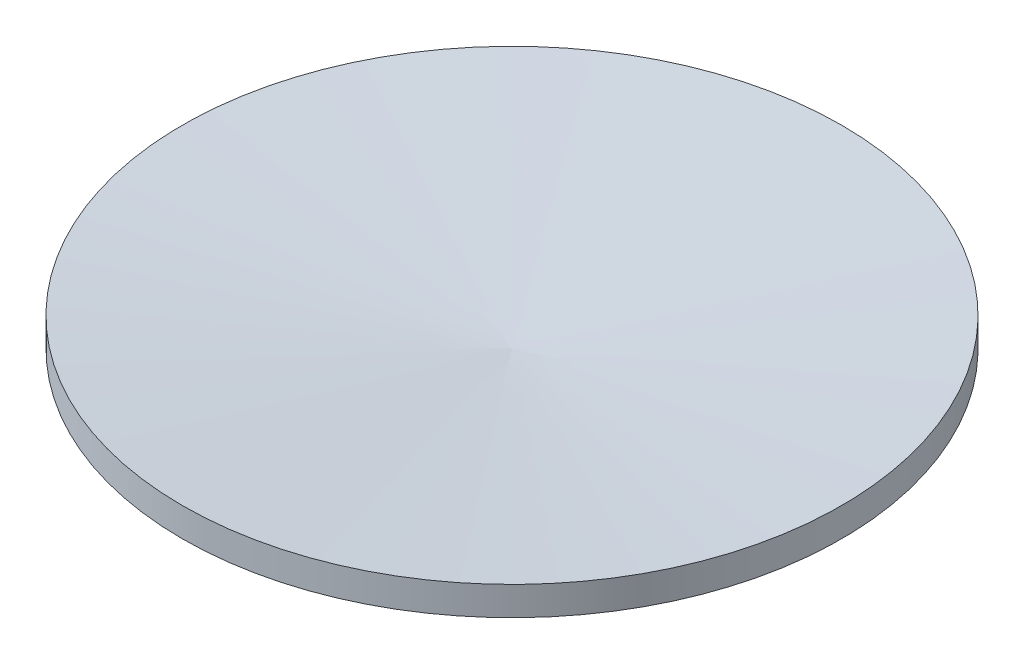
ISO-10303-21;
HEADER;
FILE_DESCRIPTION(('STEP AP214'),'2;1');
FILE_NAME('part.step','',(''),(''),'','','');
FILE_SCHEMA(('AUTOMOTIVE_DESIGN { 1 0 10303 214 1 1 1 1 }'));
ENDSEC;
DATA;
#1=APPLICATION_CONTEXT('core data for automotive mechanical design processes');
#2=APPLICATION_PROTOCOL_DEFINITION('international standard','automotive_design',2000,#1);
#3=PRODUCT_CONTEXT('',#1,'mechanical');
#4=PRODUCT('Part','Part','',(#3));
#5=PRODUCT_RELATED_PRODUCT_CATEGORY('part','',(#4));
#6=PRODUCT_DEFINITION_FORMATION('','',#4);
#7=PRODUCT_DEFINITION_CONTEXT('part definition',#1,'design');
#8=PRODUCT_DEFINITION('design','',#6,#7);
#9=PRODUCT_DEFINITION_SHAPE('','',#8);
#10=(LENGTH_UNIT() NAMED_UNIT(*) SI_UNIT(.MILLI.,.METRE.));
#11=(NAMED_UNIT(*) PLANE_ANGLE_UNIT() SI_UNIT($,.RADIAN.));
#12=(NAMED_UNIT(*) SI_UNIT($,.STERADIAN.) SOLID_ANGLE_UNIT());
#13=UNCERTAINTY_MEASURE_WITH_UNIT(LENGTH_MEASURE(1.E-05),#10,'distance_accuracy_value','');
#14=(GEOMETRIC_REPRESENTATION_CONTEXT(3) GLOBAL_UNCERTAINTY_ASSIGNED_CONTEXT((#13)) GLOBAL_UNIT_ASSIGNED_CONTEXT((#10,
#11,#12)) REPRESENTATION_CONTEXT('',''));
#15=CARTESIAN_POINT('',(0.,0.,0.));
#16=DIRECTION('',(0.,0.,1.));
#17=DIRECTION('',(1.,0.,0.));
#18=AXIS2_PLACEMENT_3D('',#15,#16,#17);
#19=CARTESIAN_POINT('',(0.,0.,0.));
#20=DIRECTION('',(0.,-1.,0.));
#21=DIRECTION('',(0.,0.,-1.));
#22=AXIS2_PLACEMENT_3D('',#19,#20,#21);
#23=PLANE('',#22);
#24=CARTESIAN_POINT('',(-0.01,0.,0.));
#25=DIRECTION('',(0.,-1.,0.));
#26=DIRECTION('',(0.,0.,-1.));
#27=AXIS2_PLACEMENT_3D('',#24,#25,#26);
#28=CIRCLE('',#27,125.050026558931);
#29=CARTESIAN_POINT('',(-0.01,0.,-125.050026558931));
#30=VERTEX_POINT('',#29);
#31=EDGE_CURVE('E10',#30,#30,#28,.T.);
#32=ORIENTED_EDGE('',*,*,#31,.T.);
#33=EDGE_LOOP('',(#32));
#34=FACE_BOUND('',#33,.T.);
#35=CARTESIAN_POINT('',(-0.01,0.,0.));
#36=DIRECTION('',(0.,-1.,0.));
#37=DIRECTION('',(0.,0.,-1.));
#38=AXIS2_PLACEMENT_3D('',#35,#36,#37);
#39=CIRCLE('',#38,0.01);
#40=CARTESIAN_POINT('',(-0.01,0.,0.01000000000001));
#41=VERTEX_POINT('',#40);
#42=EDGE_CURVE('E45',#41,#41,#39,.T.);
#43=ORIENTED_EDGE('',*,*,#42,.F.);
#44=EDGE_LOOP('',(#43));
#45=FACE_BOUND('',#44,.T.);
#46=ADVANCED_FACE('F35',(#34,#45),#23,.T.);
#47=CARTESIAN_POINT('',(-0.01,0.,0.));
#48=DIRECTION('',(0.,-1.,0.));
#49=DIRECTION('',(0.,0.,-1.));
#50=AXIS2_PLACEMENT_3D('',#47,#48,#49);
#51=CYLINDRICAL_SURFACE('',#50,125.050026558931);
#52=CARTESIAN_POINT('',(-0.01,10.939584810887,0.));
#53=DIRECTION('',(0.,-1.,0.));
#54=DIRECTION('',(0.,0.,-1.));
#55=AXIS2_PLACEMENT_3D('',#52,#53,#54);
#56=CIRCLE('',#55,125.050026558931);
#57=CARTESIAN_POINT('',(-0.01,10.939584810887,125.050026558931));
#58=VERTEX_POINT('',#57);
#59=EDGE_CURVE('E41',#58,#58,#56,.T.);
#60=ORIENTED_EDGE('',*,*,#59,.T.);
#61=EDGE_LOOP('',(#60));
#62=FACE_BOUND('',#61,.T.);
#63=ORIENTED_EDGE('',*,*,#31,.F.);
#64=EDGE_LOOP('',(#63));
#65=FACE_BOUND('',#64,.T.);
#66=ADVANCED_FACE('F56',(#62,#65),#51,.T.);
#67=CARTESIAN_POINT('',(-0.01,10.939584810887,0.));
#68=DIRECTION('',(0.,1.,0.));
#69=DIRECTION('',(0.,0.,1.));
#70=AXIS2_PLACEMENT_3D('',#67,#68,#69);
#71=CONICAL_SURFACE('',#70,125.050026558931,1.48352986419518);
#72=CARTESIAN_POINT('',(-0.01,0.,0.01000000000001));
#73=CARTESIAN_POINT('',(-0.01,0.113954008446739,1.31250027665554));
#74=CARTESIAN_POINT('',(-0.01,0.227908016893479,2.61500055331108));
#75=CARTESIAN_POINT('',(-0.01,0.455816033786957,5.22000110662215));
#76=CARTESIAN_POINT('',(-0.01,0.569770042233696,6.52250138327768));
#77=CARTESIAN_POINT('',(-0.01,0.797678059127175,9.12750193658875));
#78=CARTESIAN_POINT('',(-0.01,0.911632067573914,10.4300022132443));
#79=CARTESIAN_POINT('',(-0.01,1.13954008446739,13.0350027665554));
#80=CARTESIAN_POINT('',(-0.01,1.25349409291413,14.3375030432109));
#81=CARTESIAN_POINT('',(-0.01,1.48140210980761,16.942503596522));
#82=CARTESIAN_POINT('',(-0.01,1.59535611825435,18.2450038731775));
#83=CARTESIAN_POINT('',(-0.01,1.82326413514783,20.8500044264886));
#84=CARTESIAN_POINT('',(-0.01,1.93721814359457,22.1525047031441));
#85=CARTESIAN_POINT('',(-0.01,2.16512616048805,24.7575052564552));
#86=CARTESIAN_POINT('',(-0.01,2.27908016893479,26.0600055331107));
#87=CARTESIAN_POINT('',(-0.01,2.50698818582827,28.6650060864218));
#88=CARTESIAN_POINT('',(-0.01,2.62094219427501,29.9675063630773));
#89=CARTESIAN_POINT('',(-0.01,2.84885021116848,32.5725069163884));
#90=CARTESIAN_POINT('',(-0.01,2.96280421961522,33.8750071930439));
#91=CARTESIAN_POINT('',(-0.01,3.1907122365087,36.480007746355));
#92=CARTESIAN_POINT('',(-0.01,3.30466624495544,37.7825080230105));
#93=CARTESIAN_POINT('',(-0.01,3.53257426184892,40.3875085763216));
#94=CARTESIAN_POINT('',(-0.01,3.64652827029566,41.6900088529772));
#95=CARTESIAN_POINT('',(-0.01,3.87443628718914,44.2950094062882));
#96=CARTESIAN_POINT('',(-0.01,3.98839029563588,45.5975096829438));
#97=CARTESIAN_POINT('',(-0.01,4.21629831252936,48.2025102362548));
#98=CARTESIAN_POINT('',(-0.01,4.33025232097609,49.5050105129104));
#99=CARTESIAN_POINT('',(-0.01,4.55816033786957,52.1100110662214));
#100=CARTESIAN_POINT('',(-0.01,4.67211434631631,53.412511342877));
#101=CARTESIAN_POINT('',(-0.01,4.90002236320979,56.0175118961881));
#102=CARTESIAN_POINT('',(-0.01,5.01397637165653,57.3200121728436));
#103=CARTESIAN_POINT('',(-0.01,5.24188438855001,59.9250127261547));
#104=CARTESIAN_POINT('',(-0.01,5.35583839699675,61.2275130028102));
#105=CARTESIAN_POINT('',(-0.01,5.58374641389023,63.8325135561213));
#106=CARTESIAN_POINT('',(-0.01,5.69770042233697,65.1350138327768));
#107=CARTESIAN_POINT('',(-0.01,5.92560843923045,67.7400143860879));
#108=CARTESIAN_POINT('',(-0.01,6.03956244767718,69.0425146627434));
#109=CARTESIAN_POINT('',(-0.01,6.26747046457066,71.6475152160545));
#110=CARTESIAN_POINT('',(-0.01,6.3814244730174,72.95001549271));
#111=CARTESIAN_POINT('',(-0.01,6.60933248991088,75.5550160460211));
#112=CARTESIAN_POINT('',(-0.01,6.72328649835762,76.8575163226766));
#113=CARTESIAN_POINT('',(-0.01,6.9511945152511,79.4625168759877));
#114=CARTESIAN_POINT('',(-0.01,7.06514852369784,80.7650171526432));
#115=CARTESIAN_POINT('',(-0.01,7.29305654059132,83.3700177059543));
#116=CARTESIAN_POINT('',(-0.01,7.40701054903806,84.6725179826098));
#117=CARTESIAN_POINT('',(-0.01,7.63491856593154,87.2775185359209));
#118=CARTESIAN_POINT('',(-0.01,7.74887257437827,88.5800188125764));
#119=CARTESIAN_POINT('',(-0.01,7.97678059127175,91.1850193658875));
#120=CARTESIAN_POINT('',(-0.01,8.09073459971849,92.487519642543));
#121=CARTESIAN_POINT('',(-0.01,8.31864261661197,95.0925201958541));
#122=CARTESIAN_POINT('',(-0.01,8.43259662505871,96.3950204725096));
#123=CARTESIAN_POINT('',(-0.01,8.66050464195219,99.0000210258207));
#124=CARTESIAN_POINT('',(-0.01,8.77445865039893,100.302521302476));
#125=CARTESIAN_POINT('',(-0.01,9.00236666729241,102.907521855787));
#126=CARTESIAN_POINT('',(-0.01,9.11632067573915,104.210022132443));
#127=CARTESIAN_POINT('',(-0.01,9.34422869263263,106.815022685754));
#128=CARTESIAN_POINT('',(-0.01,9.45818270107937,108.117522962409));
#129=CARTESIAN_POINT('',(-0.01,9.68609071797284,110.722523515721));
#130=CARTESIAN_POINT('',(-0.01,9.80004472641958,112.025023792376));
#131=CARTESIAN_POINT('',(-0.01,10.0279527433131,114.630024345687));
#132=CARTESIAN_POINT('',(-0.01,10.1419067517598,115.932524622343));
#133=CARTESIAN_POINT('',(-0.01,10.3698147686533,118.537525175654));
#134=CARTESIAN_POINT('',(-0.01,10.4837687771,119.840025452309));
#135=CARTESIAN_POINT('',(-0.01,10.7116767939935,122.44502600562));
#136=CARTESIAN_POINT('',(-0.01,10.8256308024402,123.747526282276));
#137=CARTESIAN_POINT('',(-0.01,10.939584810887,125.050026558931));
#138=B_SPLINE_CURVE_WITH_KNOTS('',3,(#72,#73,#74,#75,#76,#77,#78,#79,#80,#81,#82,#83,#84,#85,
#86,#87,#88,#89,#90,#91,#92,#93,#94,#95,#96,#97,#98,#99,#100,#101,#102,#103,#104,#105,#106,#107,
#108,#109,#110,#111,#112,#113,#114,#115,#116,#117,#118,#119,#120,#121,#122,#123,#124,#125,#126,
#127,#128,#129,#130,#131,#132,#133,#134,#135,#136,#137),.UNSPECIFIED.,.F.,.F.,(4,2,2,2,2,2,2,2,
2,2,2,2,2,2,2,2,2,2,2,2,2,2,2,2,2,2,2,2,2,2,2,2,4),(0.,3.92242684833757,7.84485369667514,
11.7672805450127,15.6897073933503,19.6121342416879,23.5345610900254,27.456987938363,
31.3794147867006,35.3018416350382,39.2242684833757,43.1466953317133,47.0691221800509,
50.9915490283885,54.9139758767261,58.8364027250636,62.7588295734012,66.6812564217388,
70.6036832700763,74.5261101184139,78.4485369667515,82.3709638150891,86.2933906634267,
90.2158175117642,94.1382443601018,98.0606712084394,101.983098056777,105.905524905115,
109.827951753452,113.75037860179,117.672805450127,121.595232298465,125.517659146802),.UNSPECIFIED.);
#139=EDGE_CURVE('BSEAM52',#41,#58,#138,.T.);
#140=ORIENTED_EDGE('',*,*,#42,.T.);
#141=ORIENTED_EDGE('',*,*,#59,.F.);
#142=ORIENTED_EDGE('',*,*,#139,.T.);
#143=ORIENTED_EDGE('',*,*,#139,.F.);
#144=EDGE_LOOP('',(#140,#142,#141,#143));
#145=FACE_BOUND('',#144,.T.);
#146=ADVANCED_FACE('F52',(#145),#71,.F.);
#147=CLOSED_SHELL('',(#46,#66,#146));
#148=MANIFOLD_SOLID_BREP('B2',#147);
#149=ADVANCED_BREP_SHAPE_REPRESENTATION('',(#18,#148),#14);
#150=SHAPE_DEFINITION_REPRESENTATION(#9,#149);
ENDSEC;
END-ISO-10303-21;
